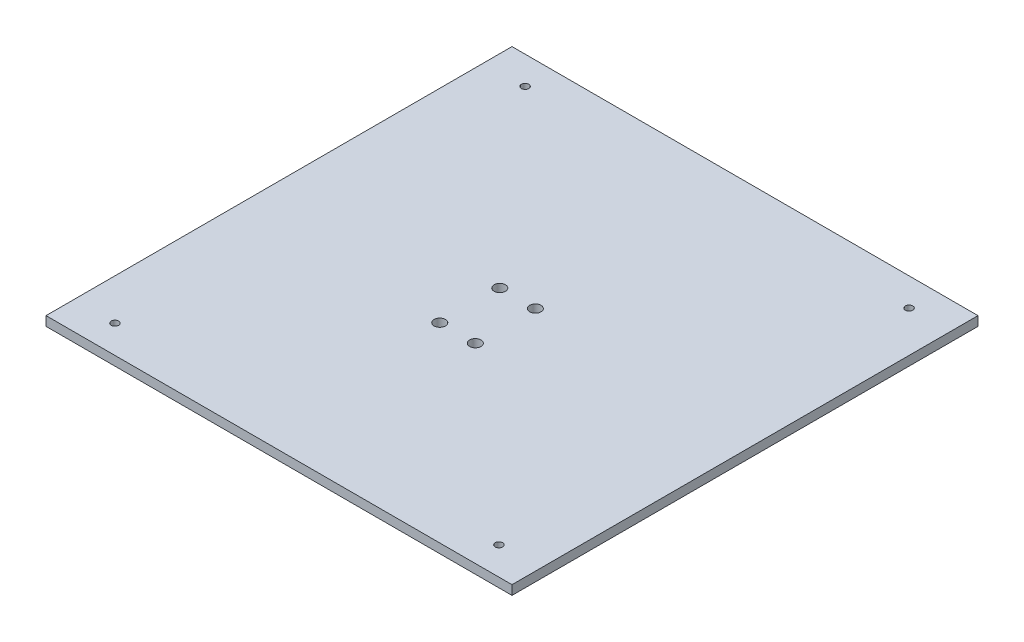
ISO-10303-21;
HEADER;
FILE_DESCRIPTION(('STEP AP214'),'2;1');
FILE_NAME('part.step','',(''),(''),'','','');
FILE_SCHEMA(('AUTOMOTIVE_DESIGN { 1 0 10303 214 1 1 1 1 }'));
ENDSEC;
DATA;
#1=APPLICATION_CONTEXT('core data for automotive mechanical design processes');
#2=APPLICATION_PROTOCOL_DEFINITION('international standard','automotive_design',2000,#1);
#3=PRODUCT_CONTEXT('',#1,'mechanical');
#4=PRODUCT('Part','Part','',(#3));
#5=PRODUCT_RELATED_PRODUCT_CATEGORY('part','',(#4));
#6=PRODUCT_DEFINITION_FORMATION('','',#4);
#7=PRODUCT_DEFINITION_CONTEXT('part definition',#1,'design');
#8=PRODUCT_DEFINITION('design','',#6,#7);
#9=PRODUCT_DEFINITION_SHAPE('','',#8);
#10=(LENGTH_UNIT() NAMED_UNIT(*) SI_UNIT(.MILLI.,.METRE.));
#11=(NAMED_UNIT(*) PLANE_ANGLE_UNIT() SI_UNIT($,.RADIAN.));
#12=(NAMED_UNIT(*) SI_UNIT($,.STERADIAN.) SOLID_ANGLE_UNIT());
#13=UNCERTAINTY_MEASURE_WITH_UNIT(LENGTH_MEASURE(1.E-05),#10,'distance_accuracy_value','');
#14=(GEOMETRIC_REPRESENTATION_CONTEXT(3) GLOBAL_UNCERTAINTY_ASSIGNED_CONTEXT((#13)) GLOBAL_UNIT_ASSIGNED_CONTEXT((#10,
#11,#12)) REPRESENTATION_CONTEXT('',''));
#15=CARTESIAN_POINT('',(0.,0.,0.));
#16=DIRECTION('',(0.,0.,1.));
#17=DIRECTION('',(1.,0.,0.));
#18=AXIS2_PLACEMENT_3D('',#15,#16,#17);
#19=CARTESIAN_POINT('',(0.,5.,0.));
#20=DIRECTION('',(1.,0.,0.));
#21=DIRECTION('',(0.,0.,-1.));
#22=AXIS2_PLACEMENT_3D('',#19,#20,#21);
#23=PLANE('',#22);
#24=DIRECTION('',(0.,0.,1.));
#25=VECTOR('',#24,1.);
#26=CARTESIAN_POINT('',(0.,0.,0.));
#27=LINE('',#26,#25);
#28=CARTESIAN_POINT('',(0.,0.,-250.));
#29=VERTEX_POINT('',#28);
#30=CARTESIAN_POINT('',(0.,0.,0.));
#31=VERTEX_POINT('',#30);
#32=EDGE_CURVE('E107',#29,#31,#27,.T.);
#33=ORIENTED_EDGE('',*,*,#32,.T.);
#34=DIRECTION('',(0.,-1.,0.));
#35=VECTOR('',#34,1.);
#36=CARTESIAN_POINT('',(0.,5.,0.));
#37=LINE('',#36,#35);
#38=CARTESIAN_POINT('',(0.,5.,0.));
#39=VERTEX_POINT('',#38);
#40=EDGE_CURVE('E11',#39,#31,#37,.T.);
#41=ORIENTED_EDGE('',*,*,#40,.F.);
#42=DIRECTION('',(0.,0.,1.));
#43=VECTOR('',#42,1.);
#44=CARTESIAN_POINT('',(0.,5.,0.));
#45=LINE('',#44,#43);
#46=CARTESIAN_POINT('',(0.,5.,-250.));
#47=VERTEX_POINT('',#46);
#48=EDGE_CURVE('E91',#47,#39,#45,.T.);
#49=ORIENTED_EDGE('',*,*,#48,.F.);
#50=DIRECTION('',(0.,-1.,0.));
#51=VECTOR('',#50,1.);
#52=CARTESIAN_POINT('',(0.,5.,-250.));
#53=LINE('',#52,#51);
#54=EDGE_CURVE('E103',#47,#29,#53,.T.);
#55=ORIENTED_EDGE('',*,*,#54,.T.);
#56=EDGE_LOOP('',(#33,#41,#49,#55));
#57=FACE_BOUND('',#56,.T.);
#58=ADVANCED_FACE('F39',(#57),#23,.F.);
#59=CARTESIAN_POINT('',(0.,5.,0.));
#60=DIRECTION('',(0.,0.,-1.));
#61=DIRECTION('',(-1.,0.,0.));
#62=AXIS2_PLACEMENT_3D('',#59,#60,#61);
#63=PLANE('',#62);
#64=DIRECTION('',(1.,0.,0.));
#65=VECTOR('',#64,1.);
#66=CARTESIAN_POINT('',(0.,0.,0.));
#67=LINE('',#66,#65);
#68=CARTESIAN_POINT('',(250.,0.,0.));
#69=VERTEX_POINT('',#68);
#70=EDGE_CURVE('E96',#31,#69,#67,.T.);
#71=ORIENTED_EDGE('',*,*,#70,.T.);
#72=DIRECTION('',(0.,-1.,0.));
#73=VECTOR('',#72,1.);
#74=CARTESIAN_POINT('',(250.,5.,0.));
#75=LINE('',#74,#73);
#76=CARTESIAN_POINT('',(250.,5.,0.));
#77=VERTEX_POINT('',#76);
#78=EDGE_CURVE('E48',#77,#69,#75,.T.);
#79=ORIENTED_EDGE('',*,*,#78,.F.);
#80=DIRECTION('',(1.,0.,0.));
#81=VECTOR('',#80,1.);
#82=CARTESIAN_POINT('',(0.,5.,0.));
#83=LINE('',#82,#81);
#84=EDGE_CURVE('E86',#39,#77,#83,.T.);
#85=ORIENTED_EDGE('',*,*,#84,.F.);
#86=ORIENTED_EDGE('',*,*,#40,.T.);
#87=EDGE_LOOP('',(#71,#79,#85,#86));
#88=FACE_BOUND('',#87,.T.);
#89=ADVANCED_FACE('F95',(#88),#63,.F.);
#90=CARTESIAN_POINT('',(250.,5.,0.));
#91=DIRECTION('',(-1.,0.,0.));
#92=DIRECTION('',(0.,0.,1.));
#93=AXIS2_PLACEMENT_3D('',#90,#91,#92);
#94=PLANE('',#93);
#95=DIRECTION('',(0.,0.,-1.));
#96=VECTOR('',#95,1.);
#97=CARTESIAN_POINT('',(250.,0.,0.));
#98=LINE('',#97,#96);
#99=CARTESIAN_POINT('',(250.,0.,-250.));
#100=VERTEX_POINT('',#99);
#101=EDGE_CURVE('E73',#69,#100,#98,.T.);
#102=ORIENTED_EDGE('',*,*,#101,.T.);
#103=DIRECTION('',(0.,-1.,0.));
#104=VECTOR('',#103,1.);
#105=CARTESIAN_POINT('',(250.,5.,-250.));
#106=LINE('',#105,#104);
#107=CARTESIAN_POINT('',(250.,5.,-250.));
#108=VERTEX_POINT('',#107);
#109=EDGE_CURVE('E98',#108,#100,#106,.T.);
#110=ORIENTED_EDGE('',*,*,#109,.F.);
#111=DIRECTION('',(0.,0.,-1.));
#112=VECTOR('',#111,1.);
#113=CARTESIAN_POINT('',(250.,5.,0.));
#114=LINE('',#113,#112);
#115=EDGE_CURVE('E89',#77,#108,#114,.T.);
#116=ORIENTED_EDGE('',*,*,#115,.F.);
#117=ORIENTED_EDGE('',*,*,#78,.T.);
#118=EDGE_LOOP('',(#102,#110,#116,#117));
#119=FACE_BOUND('',#118,.T.);
#120=ADVANCED_FACE('F99',(#119),#94,.F.);
#121=CARTESIAN_POINT('',(0.,5.,-250.));
#122=DIRECTION('',(0.,0.,1.));
#123=DIRECTION('',(1.,0.,0.));
#124=AXIS2_PLACEMENT_3D('',#121,#122,#123);
#125=PLANE('',#124);
#126=DIRECTION('',(-1.,0.,0.));
#127=VECTOR('',#126,1.);
#128=CARTESIAN_POINT('',(0.,0.,-250.));
#129=LINE('',#128,#127);
#130=EDGE_CURVE('E79',#100,#29,#129,.T.);
#131=ORIENTED_EDGE('',*,*,#130,.T.);
#132=ORIENTED_EDGE('',*,*,#54,.F.);
#133=DIRECTION('',(-1.,0.,0.));
#134=VECTOR('',#133,1.);
#135=CARTESIAN_POINT('',(0.,5.,-250.));
#136=LINE('',#135,#134);
#137=EDGE_CURVE('E56',#108,#47,#136,.T.);
#138=ORIENTED_EDGE('',*,*,#137,.F.);
#139=ORIENTED_EDGE('',*,*,#109,.T.);
#140=EDGE_LOOP('',(#131,#132,#138,#139));
#141=FACE_BOUND('',#140,.T.);
#142=ADVANCED_FACE('F121',(#141),#125,.F.);
#143=CARTESIAN_POINT('',(0.,5.,0.));
#144=DIRECTION('',(0.,-1.,0.));
#145=DIRECTION('',(0.,0.,-1.));
#146=AXIS2_PLACEMENT_3D('',#143,#144,#145);
#147=PLANE('',#146);
#148=CARTESIAN_POINT('',(228.,5.,-15.));
#149=DIRECTION('',(0.,1.,0.));
#150=DIRECTION('',(0.,0.,1.));
#151=AXIS2_PLACEMENT_3D('',#148,#149,#150);
#152=CIRCLE('',#151,2.);
#153=CARTESIAN_POINT('',(228.,5.,-13.));
#154=VERTEX_POINT('',#153);
#155=EDGE_CURVE('E177',#154,#154,#152,.T.);
#156=ORIENTED_EDGE('',*,*,#155,.F.);
#157=EDGE_LOOP('',(#156));
#158=FACE_BOUND('',#157,.T.);
#159=CARTESIAN_POINT('',(228.,5.,-235.));
#160=DIRECTION('',(0.,1.,0.));
#161=DIRECTION('',(0.,0.,1.));
#162=AXIS2_PLACEMENT_3D('',#159,#160,#161);
#163=CIRCLE('',#162,2.);
#164=CARTESIAN_POINT('',(228.,5.,-233.));
#165=VERTEX_POINT('',#164);
#166=EDGE_CURVE('E178',#165,#165,#163,.T.);
#167=ORIENTED_EDGE('',*,*,#166,.F.);
#168=EDGE_LOOP('',(#167));
#169=FACE_BOUND('',#168,.T.);
#170=CARTESIAN_POINT('',(21.9999999999999,5.,-235.));
#171=DIRECTION('',(0.,1.,0.));
#172=DIRECTION('',(0.,0.,1.));
#173=AXIS2_PLACEMENT_3D('',#170,#171,#172);
#174=CIRCLE('',#173,2.);
#175=CARTESIAN_POINT('',(21.9999999999999,5.,-233.));
#176=VERTEX_POINT('',#175);
#177=EDGE_CURVE('E168',#176,#176,#174,.T.);
#178=ORIENTED_EDGE('',*,*,#177,.F.);
#179=EDGE_LOOP('',(#178));
#180=FACE_BOUND('',#179,.T.);
#181=CARTESIAN_POINT('',(22.,5.,-15.));
#182=DIRECTION('',(0.,1.,0.));
#183=DIRECTION('',(0.,0.,1.));
#184=AXIS2_PLACEMENT_3D('',#181,#182,#183);
#185=CIRCLE('',#184,2.);
#186=CARTESIAN_POINT('',(22.,5.,-13.));
#187=VERTEX_POINT('',#186);
#188=EDGE_CURVE('E161',#187,#187,#185,.T.);
#189=ORIENTED_EDGE('',*,*,#188,.F.);
#190=EDGE_LOOP('',(#189));
#191=FACE_BOUND('',#190,.T.);
#192=CARTESIAN_POINT('',(108.9,5.,-134.54));
#193=DIRECTION('',(0.,1.,0.));
#194=DIRECTION('',(0.,0.,1.));
#195=AXIS2_PLACEMENT_3D('',#192,#193,#194);
#196=CIRCLE('',#195,3.04999999999999);
#197=CARTESIAN_POINT('',(108.9,5.,-131.49));
#198=VERTEX_POINT('',#197);
#199=EDGE_CURVE('E153',#198,#198,#196,.T.);
#200=ORIENTED_EDGE('',*,*,#199,.F.);
#201=EDGE_LOOP('',(#200));
#202=FACE_BOUND('',#201,.T.);
#203=CARTESIAN_POINT('',(127.98,5.,-134.54));
#204=DIRECTION('',(0.,1.,0.));
#205=DIRECTION('',(0.,0.,1.));
#206=AXIS2_PLACEMENT_3D('',#203,#204,#205);
#207=CIRCLE('',#206,3.04999999999999);
#208=CARTESIAN_POINT('',(127.98,5.,-131.49));
#209=VERTEX_POINT('',#208);
#210=EDGE_CURVE('E145',#209,#209,#207,.T.);
#211=ORIENTED_EDGE('',*,*,#210,.F.);
#212=EDGE_LOOP('',(#211));
#213=FACE_BOUND('',#212,.T.);
#214=CARTESIAN_POINT('',(127.98,5.,-102.34));
#215=DIRECTION('',(0.,1.,0.));
#216=DIRECTION('',(0.,0.,1.));
#217=AXIS2_PLACEMENT_3D('',#214,#215,#216);
#218=CIRCLE('',#217,3.04999999999999);
#219=CARTESIAN_POINT('',(127.98,5.,-99.29));
#220=VERTEX_POINT('',#219);
#221=EDGE_CURVE('E137',#220,#220,#218,.T.);
#222=ORIENTED_EDGE('',*,*,#221,.F.);
#223=EDGE_LOOP('',(#222));
#224=FACE_BOUND('',#223,.T.);
#225=CARTESIAN_POINT('',(108.9,5.,-102.34));
#226=DIRECTION('',(0.,1.,0.));
#227=DIRECTION('',(0.,0.,1.));
#228=AXIS2_PLACEMENT_3D('',#225,#226,#227);
#229=CIRCLE('',#228,3.04999999999999);
#230=CARTESIAN_POINT('',(108.9,5.,-99.29));
#231=VERTEX_POINT('',#230);
#232=EDGE_CURVE('E128',#231,#231,#229,.T.);
#233=ORIENTED_EDGE('',*,*,#232,.F.);
#234=EDGE_LOOP('',(#233));
#235=FACE_BOUND('',#234,.T.);
#236=ORIENTED_EDGE('',*,*,#48,.T.);
#237=ORIENTED_EDGE('',*,*,#84,.T.);
#238=ORIENTED_EDGE('',*,*,#115,.T.);
#239=ORIENTED_EDGE('',*,*,#137,.T.);
#240=EDGE_LOOP('',(#236,#237,#238,#239));
#241=FACE_BOUND('',#240,.T.);
#242=ADVANCED_FACE('F87',(#158,#169,#180,#191,#202,#213,#224,#235,#241),#147,.F.);
#243=CARTESIAN_POINT('',(0.,0.,0.));
#244=DIRECTION('',(0.,-1.,0.));
#245=DIRECTION('',(0.,0.,-1.));
#246=AXIS2_PLACEMENT_3D('',#243,#244,#245);
#247=PLANE('',#246);
#248=CARTESIAN_POINT('',(228.,0.,-15.));
#249=DIRECTION('',(0.,1.,0.));
#250=DIRECTION('',(0.,0.,1.));
#251=AXIS2_PLACEMENT_3D('',#248,#249,#250);
#252=CIRCLE('',#251,2.);
#253=CARTESIAN_POINT('',(228.,0.,-13.));
#254=VERTEX_POINT('',#253);
#255=EDGE_CURVE('E133',#254,#254,#252,.T.);
#256=ORIENTED_EDGE('',*,*,#255,.T.);
#257=EDGE_LOOP('',(#256));
#258=FACE_BOUND('',#257,.T.);
#259=CARTESIAN_POINT('',(228.,0.,-235.));
#260=DIRECTION('',(0.,1.,0.));
#261=DIRECTION('',(0.,0.,1.));
#262=AXIS2_PLACEMENT_3D('',#259,#260,#261);
#263=CIRCLE('',#262,2.);
#264=CARTESIAN_POINT('',(228.,0.,-233.));
#265=VERTEX_POINT('',#264);
#266=EDGE_CURVE('E173',#265,#265,#263,.T.);
#267=ORIENTED_EDGE('',*,*,#266,.T.);
#268=EDGE_LOOP('',(#267));
#269=FACE_BOUND('',#268,.T.);
#270=CARTESIAN_POINT('',(21.9999999999999,0.,-235.));
#271=DIRECTION('',(0.,1.,0.));
#272=DIRECTION('',(0.,0.,1.));
#273=AXIS2_PLACEMENT_3D('',#270,#271,#272);
#274=CIRCLE('',#273,2.);
#275=CARTESIAN_POINT('',(21.9999999999999,0.,-233.));
#276=VERTEX_POINT('',#275);
#277=EDGE_CURVE('E172',#276,#276,#274,.T.);
#278=ORIENTED_EDGE('',*,*,#277,.T.);
#279=EDGE_LOOP('',(#278));
#280=FACE_BOUND('',#279,.T.);
#281=CARTESIAN_POINT('',(22.,0.,-15.));
#282=DIRECTION('',(0.,1.,0.));
#283=DIRECTION('',(0.,0.,1.));
#284=AXIS2_PLACEMENT_3D('',#281,#282,#283);
#285=CIRCLE('',#284,2.);
#286=CARTESIAN_POINT('',(22.,0.,-13.));
#287=VERTEX_POINT('',#286);
#288=EDGE_CURVE('E111',#287,#287,#285,.T.);
#289=ORIENTED_EDGE('',*,*,#288,.T.);
#290=EDGE_LOOP('',(#289));
#291=FACE_BOUND('',#290,.T.);
#292=CARTESIAN_POINT('',(108.9,0.,-134.54));
#293=DIRECTION('',(0.,1.,0.));
#294=DIRECTION('',(0.,0.,1.));
#295=AXIS2_PLACEMENT_3D('',#292,#293,#294);
#296=CIRCLE('',#295,3.04999999999999);
#297=CARTESIAN_POINT('',(108.9,0.,-131.49));
#298=VERTEX_POINT('',#297);
#299=EDGE_CURVE('E157',#298,#298,#296,.T.);
#300=ORIENTED_EDGE('',*,*,#299,.T.);
#301=EDGE_LOOP('',(#300));
#302=FACE_BOUND('',#301,.T.);
#303=CARTESIAN_POINT('',(127.98,0.,-134.54));
#304=DIRECTION('',(0.,1.,0.));
#305=DIRECTION('',(0.,0.,1.));
#306=AXIS2_PLACEMENT_3D('',#303,#304,#305);
#307=CIRCLE('',#306,3.04999999999999);
#308=CARTESIAN_POINT('',(127.98,0.,-131.49));
#309=VERTEX_POINT('',#308);
#310=EDGE_CURVE('E149',#309,#309,#307,.T.);
#311=ORIENTED_EDGE('',*,*,#310,.T.);
#312=EDGE_LOOP('',(#311));
#313=FACE_BOUND('',#312,.T.);
#314=CARTESIAN_POINT('',(127.98,0.,-102.34));
#315=DIRECTION('',(0.,1.,0.));
#316=DIRECTION('',(0.,0.,1.));
#317=AXIS2_PLACEMENT_3D('',#314,#315,#316);
#318=CIRCLE('',#317,3.04999999999999);
#319=CARTESIAN_POINT('',(127.98,0.,-99.29));
#320=VERTEX_POINT('',#319);
#321=EDGE_CURVE('E141',#320,#320,#318,.T.);
#322=ORIENTED_EDGE('',*,*,#321,.T.);
#323=EDGE_LOOP('',(#322));
#324=FACE_BOUND('',#323,.T.);
#325=CARTESIAN_POINT('',(108.9,0.,-102.34));
#326=DIRECTION('',(0.,1.,0.));
#327=DIRECTION('',(0.,0.,1.));
#328=AXIS2_PLACEMENT_3D('',#325,#326,#327);
#329=CIRCLE('',#328,3.04999999999999);
#330=CARTESIAN_POINT('',(108.9,0.,-99.29));
#331=VERTEX_POINT('',#330);
#332=EDGE_CURVE('E132',#331,#331,#329,.T.);
#333=ORIENTED_EDGE('',*,*,#332,.T.);
#334=EDGE_LOOP('',(#333));
#335=FACE_BOUND('',#334,.T.);
#336=ORIENTED_EDGE('',*,*,#32,.F.);
#337=ORIENTED_EDGE('',*,*,#130,.F.);
#338=ORIENTED_EDGE('',*,*,#101,.F.);
#339=ORIENTED_EDGE('',*,*,#70,.F.);
#340=EDGE_LOOP('',(#336,#337,#338,#339));
#341=FACE_BOUND('',#340,.T.);
#342=ADVANCED_FACE('F124',(#258,#269,#280,#291,#302,#313,#324,#335,#341),#247,.T.);
#343=CARTESIAN_POINT('',(108.9,0.,-102.34));
#344=DIRECTION('',(0.,1.,0.));
#345=DIRECTION('',(0.,0.,1.));
#346=AXIS2_PLACEMENT_3D('',#343,#344,#345);
#347=CYLINDRICAL_SURFACE('',#346,3.04999999999999);
#348=ORIENTED_EDGE('',*,*,#332,.F.);
#349=EDGE_LOOP('',(#348));
#350=FACE_BOUND('',#349,.T.);
#351=ORIENTED_EDGE('',*,*,#232,.T.);
#352=EDGE_LOOP('',(#351));
#353=FACE_BOUND('',#352,.T.);
#354=ADVANCED_FACE('F218',(#350,#353),#347,.F.);
#355=CARTESIAN_POINT('',(127.98,0.,-102.34));
#356=DIRECTION('',(0.,1.,0.));
#357=DIRECTION('',(0.,0.,1.));
#358=AXIS2_PLACEMENT_3D('',#355,#356,#357);
#359=CYLINDRICAL_SURFACE('',#358,3.04999999999999);
#360=ORIENTED_EDGE('',*,*,#321,.F.);
#361=EDGE_LOOP('',(#360));
#362=FACE_BOUND('',#361,.T.);
#363=ORIENTED_EDGE('',*,*,#221,.T.);
#364=EDGE_LOOP('',(#363));
#365=FACE_BOUND('',#364,.T.);
#366=ADVANCED_FACE('F220',(#362,#365),#359,.F.);
#367=CARTESIAN_POINT('',(127.98,0.,-134.54));
#368=DIRECTION('',(0.,1.,0.));
#369=DIRECTION('',(0.,0.,1.));
#370=AXIS2_PLACEMENT_3D('',#367,#368,#369);
#371=CYLINDRICAL_SURFACE('',#370,3.04999999999999);
#372=ORIENTED_EDGE('',*,*,#310,.F.);
#373=EDGE_LOOP('',(#372));
#374=FACE_BOUND('',#373,.T.);
#375=ORIENTED_EDGE('',*,*,#210,.T.);
#376=EDGE_LOOP('',(#375));
#377=FACE_BOUND('',#376,.T.);
#378=ADVANCED_FACE('F227',(#374,#377),#371,.F.);
#379=CARTESIAN_POINT('',(108.9,0.,-134.54));
#380=DIRECTION('',(0.,1.,0.));
#381=DIRECTION('',(0.,0.,1.));
#382=AXIS2_PLACEMENT_3D('',#379,#380,#381);
#383=CYLINDRICAL_SURFACE('',#382,3.04999999999999);
#384=ORIENTED_EDGE('',*,*,#299,.F.);
#385=EDGE_LOOP('',(#384));
#386=FACE_BOUND('',#385,.T.);
#387=ORIENTED_EDGE('',*,*,#199,.T.);
#388=EDGE_LOOP('',(#387));
#389=FACE_BOUND('',#388,.T.);
#390=ADVANCED_FACE('F292',(#386,#389),#383,.F.);
#391=CARTESIAN_POINT('',(22.,0.,-15.));
#392=DIRECTION('',(0.,1.,0.));
#393=DIRECTION('',(0.,0.,1.));
#394=AXIS2_PLACEMENT_3D('',#391,#392,#393);
#395=CYLINDRICAL_SURFACE('',#394,2.);
#396=ORIENTED_EDGE('',*,*,#288,.F.);
#397=EDGE_LOOP('',(#396));
#398=FACE_BOUND('',#397,.T.);
#399=ORIENTED_EDGE('',*,*,#188,.T.);
#400=EDGE_LOOP('',(#399));
#401=FACE_BOUND('',#400,.T.);
#402=ADVANCED_FACE('F266',(#398,#401),#395,.F.);
#403=CARTESIAN_POINT('',(21.9999999999999,0.,-235.));
#404=DIRECTION('',(0.,1.,0.));
#405=DIRECTION('',(0.,0.,1.));
#406=AXIS2_PLACEMENT_3D('',#403,#404,#405);
#407=CYLINDRICAL_SURFACE('',#406,2.);
#408=ORIENTED_EDGE('',*,*,#277,.F.);
#409=EDGE_LOOP('',(#408));
#410=FACE_BOUND('',#409,.T.);
#411=ORIENTED_EDGE('',*,*,#177,.T.);
#412=EDGE_LOOP('',(#411));
#413=FACE_BOUND('',#412,.T.);
#414=ADVANCED_FACE('F261',(#410,#413),#407,.F.);
#415=CARTESIAN_POINT('',(228.,0.,-235.));
#416=DIRECTION('',(0.,1.,0.));
#417=DIRECTION('',(0.,0.,1.));
#418=AXIS2_PLACEMENT_3D('',#415,#416,#417);
#419=CYLINDRICAL_SURFACE('',#418,2.);
#420=ORIENTED_EDGE('',*,*,#266,.F.);
#421=EDGE_LOOP('',(#420));
#422=FACE_BOUND('',#421,.T.);
#423=ORIENTED_EDGE('',*,*,#166,.T.);
#424=EDGE_LOOP('',(#423));
#425=FACE_BOUND('',#424,.T.);
#426=ADVANCED_FACE('F197',(#422,#425),#419,.F.);
#427=CARTESIAN_POINT('',(228.,0.,-15.));
#428=DIRECTION('',(0.,1.,0.));
#429=DIRECTION('',(0.,0.,1.));
#430=AXIS2_PLACEMENT_3D('',#427,#428,#429);
#431=CYLINDRICAL_SURFACE('',#430,2.);
#432=ORIENTED_EDGE('',*,*,#255,.F.);
#433=EDGE_LOOP('',(#432));
#434=FACE_BOUND('',#433,.T.);
#435=ORIENTED_EDGE('',*,*,#155,.T.);
#436=EDGE_LOOP('',(#435));
#437=FACE_BOUND('',#436,.T.);
#438=ADVANCED_FACE('F194',(#434,#437),#431,.F.);
#439=CLOSED_SHELL('',(#58,#89,#120,#142,#242,#342,#354,#366,#378,#390,#402,#414,#426,#438));
#440=MANIFOLD_SOLID_BREP('B2',#439);
#441=ADVANCED_BREP_SHAPE_REPRESENTATION('',(#18,#440),#14);
#442=SHAPE_DEFINITION_REPRESENTATION(#9,#441);
ENDSEC;
END-ISO-10303-21;
